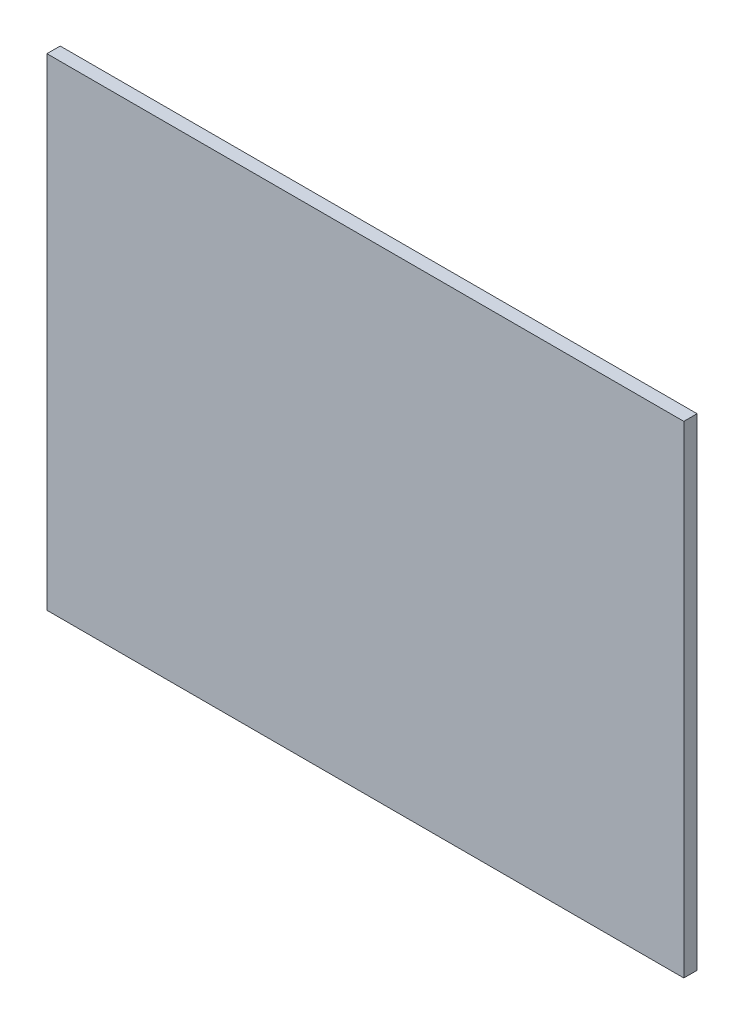
ISO-10303-21;
HEADER;
FILE_DESCRIPTION(('STEP AP214'),'2;1');
FILE_NAME('part.step','',(''),(''),'','','');
FILE_SCHEMA(('AUTOMOTIVE_DESIGN { 1 0 10303 214 1 1 1 1 }'));
ENDSEC;
DATA;
#1=APPLICATION_CONTEXT('core data for automotive mechanical design processes');
#2=APPLICATION_PROTOCOL_DEFINITION('international standard','automotive_design',2000,#1);
#3=PRODUCT_CONTEXT('',#1,'mechanical');
#4=PRODUCT('Part','Part','',(#3));
#5=PRODUCT_RELATED_PRODUCT_CATEGORY('part','',(#4));
#6=PRODUCT_DEFINITION_FORMATION('','',#4);
#7=PRODUCT_DEFINITION_CONTEXT('part definition',#1,'design');
#8=PRODUCT_DEFINITION('design','',#6,#7);
#9=PRODUCT_DEFINITION_SHAPE('','',#8);
#10=(LENGTH_UNIT() NAMED_UNIT(*) SI_UNIT(.MILLI.,.METRE.));
#11=(NAMED_UNIT(*) PLANE_ANGLE_UNIT() SI_UNIT($,.RADIAN.));
#12=(NAMED_UNIT(*) SI_UNIT($,.STERADIAN.) SOLID_ANGLE_UNIT());
#13=UNCERTAINTY_MEASURE_WITH_UNIT(LENGTH_MEASURE(1.E-05),#10,'distance_accuracy_value','');
#14=(GEOMETRIC_REPRESENTATION_CONTEXT(3) GLOBAL_UNCERTAINTY_ASSIGNED_CONTEXT((#13)) GLOBAL_UNIT_ASSIGNED_CONTEXT((#10,
#11,#12)) REPRESENTATION_CONTEXT('',''));
#15=CARTESIAN_POINT('',(0.,0.,0.));
#16=DIRECTION('',(0.,0.,1.));
#17=DIRECTION('',(1.,0.,0.));
#18=AXIS2_PLACEMENT_3D('',#15,#16,#17);
#19=CARTESIAN_POINT('',(457.2,1625.79841597282,-279.4));
#20=DIRECTION('',(-1.,0.,0.));
#21=DIRECTION('',(0.,0.,1.));
#22=AXIS2_PLACEMENT_3D('',#19,#20,#21);
#23=PLANE('',#22);
#24=DIRECTION('',(0.,0.,-1.));
#25=VECTOR('',#24,1.);
#26=CARTESIAN_POINT('',(457.2,692.15,-279.4));
#27=LINE('',#26,#25);
#28=CARTESIAN_POINT('',(457.2,692.15,-279.4));
#29=VERTEX_POINT('',#28);
#30=CARTESIAN_POINT('',(457.2,692.15,-298.45));
#31=VERTEX_POINT('',#30);
#32=EDGE_CURVE('E92',#29,#31,#27,.T.);
#33=ORIENTED_EDGE('',*,*,#32,.F.);
#34=DIRECTION('',(0.,-1.,0.));
#35=VECTOR('',#34,1.);
#36=CARTESIAN_POINT('',(457.2,1625.79841597282,-279.4));
#37=LINE('',#36,#35);
#38=CARTESIAN_POINT('',(457.2,0.,-279.4));
#39=VERTEX_POINT('',#38);
#40=EDGE_CURVE('E45',#29,#39,#37,.T.);
#41=ORIENTED_EDGE('',*,*,#40,.T.);
#42=DIRECTION('',(0.,0.,-1.));
#43=VECTOR('',#42,1.);
#44=CARTESIAN_POINT('',(457.2,0.,-279.4));
#45=LINE('',#44,#43);
#46=CARTESIAN_POINT('',(457.2,0.,-298.45));
#47=VERTEX_POINT('',#46);
#48=EDGE_CURVE('E90',#39,#47,#45,.T.);
#49=ORIENTED_EDGE('',*,*,#48,.T.);
#50=DIRECTION('',(0.,-1.,0.));
#51=VECTOR('',#50,1.);
#52=CARTESIAN_POINT('',(457.2,1625.79841597282,-298.45));
#53=LINE('',#52,#51);
#54=EDGE_CURVE('E81',#31,#47,#53,.T.);
#55=ORIENTED_EDGE('',*,*,#54,.F.);
#56=EDGE_LOOP('',(#33,#41,#49,#55));
#57=FACE_BOUND('',#56,.T.);
#58=ADVANCED_FACE('F41',(#57),#23,.F.);
#59=CARTESIAN_POINT('',(457.2,1625.79841597282,-298.45));
#60=DIRECTION('',(0.,0.,1.));
#61=DIRECTION('',(1.,0.,0.));
#62=AXIS2_PLACEMENT_3D('',#59,#60,#61);
#63=PLANE('',#62);
#64=DIRECTION('',(-1.,0.,0.));
#65=VECTOR('',#64,1.);
#66=CARTESIAN_POINT('',(457.2,692.15,-298.45));
#67=LINE('',#66,#65);
#68=CARTESIAN_POINT('',(-457.2,692.15,-298.45));
#69=VERTEX_POINT('',#68);
#70=EDGE_CURVE('E51',#31,#69,#67,.T.);
#71=ORIENTED_EDGE('',*,*,#70,.F.);
#72=ORIENTED_EDGE('',*,*,#54,.T.);
#73=DIRECTION('',(-1.,0.,0.));
#74=VECTOR('',#73,1.);
#75=CARTESIAN_POINT('',(457.2,0.,-298.45));
#76=LINE('',#75,#74);
#77=CARTESIAN_POINT('',(-457.2,0.,-298.45));
#78=VERTEX_POINT('',#77);
#79=EDGE_CURVE('E104',#47,#78,#76,.T.);
#80=ORIENTED_EDGE('',*,*,#79,.T.);
#81=DIRECTION('',(0.,-1.,0.));
#82=VECTOR('',#81,1.);
#83=CARTESIAN_POINT('',(-457.2,1625.79841597282,-298.45));
#84=LINE('',#83,#82);
#85=EDGE_CURVE('E119',#69,#78,#84,.T.);
#86=ORIENTED_EDGE('',*,*,#85,.F.);
#87=EDGE_LOOP('',(#71,#72,#80,#86));
#88=FACE_BOUND('',#87,.T.);
#89=ADVANCED_FACE('F128',(#88),#63,.F.);
#90=CARTESIAN_POINT('',(-457.2,1625.79841597282,-298.45));
#91=DIRECTION('',(1.,0.,0.));
#92=DIRECTION('',(0.,0.,-1.));
#93=AXIS2_PLACEMENT_3D('',#90,#91,#92);
#94=PLANE('',#93);
#95=DIRECTION('',(0.,0.,1.));
#96=VECTOR('',#95,1.);
#97=CARTESIAN_POINT('',(-457.2,692.15,-298.45));
#98=LINE('',#97,#96);
#99=CARTESIAN_POINT('',(-457.2,692.15,-279.4));
#100=VERTEX_POINT('',#99);
#101=EDGE_CURVE('E12',#69,#100,#98,.T.);
#102=ORIENTED_EDGE('',*,*,#101,.F.);
#103=ORIENTED_EDGE('',*,*,#85,.T.);
#104=DIRECTION('',(0.,0.,1.));
#105=VECTOR('',#104,1.);
#106=CARTESIAN_POINT('',(-457.2,0.,-298.45));
#107=LINE('',#106,#105);
#108=CARTESIAN_POINT('',(-457.2,0.,-279.4));
#109=VERTEX_POINT('',#108);
#110=EDGE_CURVE('E121',#78,#109,#107,.T.);
#111=ORIENTED_EDGE('',*,*,#110,.T.);
#112=DIRECTION('',(0.,-1.,0.));
#113=VECTOR('',#112,1.);
#114=CARTESIAN_POINT('',(-457.2,1625.79841597282,-279.4));
#115=LINE('',#114,#113);
#116=EDGE_CURVE('E64',#100,#109,#115,.T.);
#117=ORIENTED_EDGE('',*,*,#116,.F.);
#118=EDGE_LOOP('',(#102,#103,#111,#117));
#119=FACE_BOUND('',#118,.T.);
#120=ADVANCED_FACE('F127',(#119),#94,.F.);
#121=CARTESIAN_POINT('',(-457.2,1625.79841597282,-279.4));
#122=DIRECTION('',(0.,0.,-1.));
#123=DIRECTION('',(-1.,0.,0.));
#124=AXIS2_PLACEMENT_3D('',#121,#122,#123);
#125=PLANE('',#124);
#126=DIRECTION('',(1.,0.,0.));
#127=VECTOR('',#126,1.);
#128=CARTESIAN_POINT('',(-457.2,692.15,-279.4));
#129=LINE('',#128,#127);
#130=EDGE_CURVE('E101',#100,#29,#129,.T.);
#131=ORIENTED_EDGE('',*,*,#130,.F.);
#132=ORIENTED_EDGE('',*,*,#116,.T.);
#133=DIRECTION('',(1.,0.,0.));
#134=VECTOR('',#133,1.);
#135=CARTESIAN_POINT('',(-457.2,0.,-279.4));
#136=LINE('',#135,#134);
#137=EDGE_CURVE('E96',#109,#39,#136,.T.);
#138=ORIENTED_EDGE('',*,*,#137,.T.);
#139=ORIENTED_EDGE('',*,*,#40,.F.);
#140=EDGE_LOOP('',(#131,#132,#138,#139));
#141=FACE_BOUND('',#140,.T.);
#142=ADVANCED_FACE('F97',(#141),#125,.F.);
#143=CARTESIAN_POINT('',(0.,0.,0.));
#144=DIRECTION('',(0.,1.,0.));
#145=DIRECTION('',(0.,0.,1.));
#146=AXIS2_PLACEMENT_3D('',#143,#144,#145);
#147=PLANE('',#146);
#148=ORIENTED_EDGE('',*,*,#48,.F.);
#149=ORIENTED_EDGE('',*,*,#137,.F.);
#150=ORIENTED_EDGE('',*,*,#110,.F.);
#151=ORIENTED_EDGE('',*,*,#79,.F.);
#152=EDGE_LOOP('',(#148,#149,#150,#151));
#153=FACE_BOUND('',#152,.T.);
#154=ADVANCED_FACE('F103',(#153),#147,.F.);
#155=CARTESIAN_POINT('',(0.,692.15,0.));
#156=DIRECTION('',(0.,1.,0.));
#157=DIRECTION('',(0.,0.,1.));
#158=AXIS2_PLACEMENT_3D('',#155,#156,#157);
#159=PLANE('',#158);
#160=ORIENTED_EDGE('',*,*,#130,.T.);
#161=ORIENTED_EDGE('',*,*,#32,.T.);
#162=ORIENTED_EDGE('',*,*,#70,.T.);
#163=ORIENTED_EDGE('',*,*,#101,.T.);
#164=EDGE_LOOP('',(#160,#161,#162,#163));
#165=FACE_BOUND('',#164,.T.);
#166=ADVANCED_FACE('F43',(#165),#159,.T.);
#167=CLOSED_SHELL('',(#58,#89,#120,#142,#154,#166));
#168=MANIFOLD_SOLID_BREP('B2',#167);
#169=ADVANCED_BREP_SHAPE_REPRESENTATION('',(#18,#168),#14);
#170=SHAPE_DEFINITION_REPRESENTATION(#9,#169);
ENDSEC;
END-ISO-10303-21;
